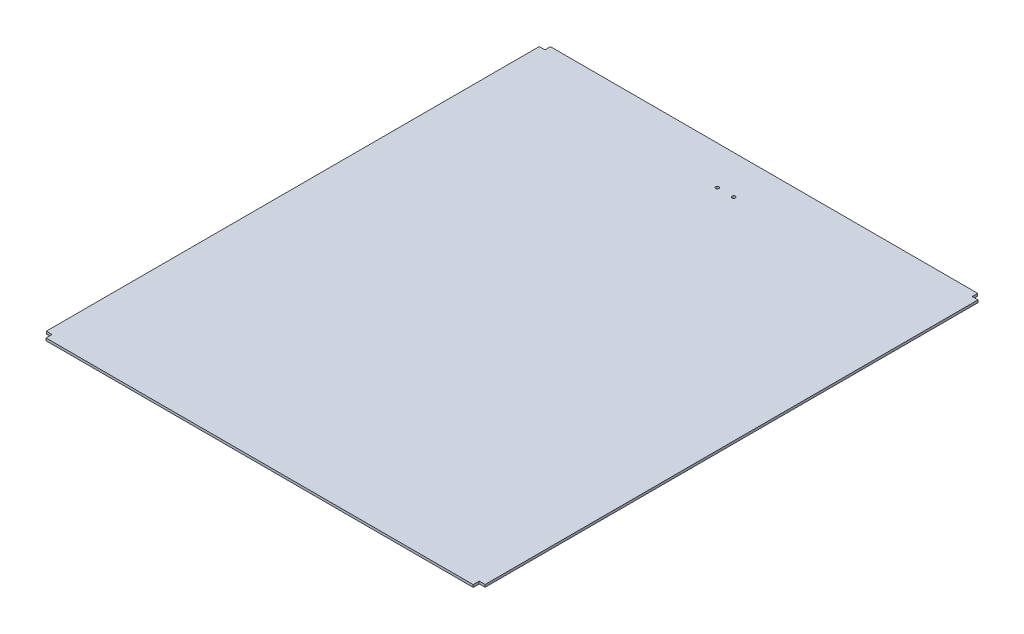
ISO-10303-21;
HEADER;
FILE_DESCRIPTION(('STEP AP214'),'2;1');
FILE_NAME('part.step','',(''),(''),'','','');
FILE_SCHEMA(('AUTOMOTIVE_DESIGN { 1 0 10303 214 1 1 1 1 }'));
ENDSEC;
DATA;
#1=APPLICATION_CONTEXT('core data for automotive mechanical design processes');
#2=APPLICATION_PROTOCOL_DEFINITION('international standard','automotive_design',2000,#1);
#3=PRODUCT_CONTEXT('',#1,'mechanical');
#4=PRODUCT('Part','Part','',(#3));
#5=PRODUCT_RELATED_PRODUCT_CATEGORY('part','',(#4));
#6=PRODUCT_DEFINITION_FORMATION('','',#4);
#7=PRODUCT_DEFINITION_CONTEXT('part definition',#1,'design');
#8=PRODUCT_DEFINITION('design','',#6,#7);
#9=PRODUCT_DEFINITION_SHAPE('','',#8);
#10=(LENGTH_UNIT() NAMED_UNIT(*) SI_UNIT(.MILLI.,.METRE.));
#11=(NAMED_UNIT(*) PLANE_ANGLE_UNIT() SI_UNIT($,.RADIAN.));
#12=(NAMED_UNIT(*) SI_UNIT($,.STERADIAN.) SOLID_ANGLE_UNIT());
#13=UNCERTAINTY_MEASURE_WITH_UNIT(LENGTH_MEASURE(1.E-05),#10,'distance_accuracy_value','');
#14=(GEOMETRIC_REPRESENTATION_CONTEXT(3) GLOBAL_UNCERTAINTY_ASSIGNED_CONTEXT((#13)) GLOBAL_UNIT_ASSIGNED_CONTEXT((#10,
#11,#12)) REPRESENTATION_CONTEXT('',''));
#15=CARTESIAN_POINT('',(0.,0.,0.));
#16=DIRECTION('',(0.,0.,1.));
#17=DIRECTION('',(1.,0.,0.));
#18=AXIS2_PLACEMENT_3D('',#15,#16,#17);
#19=CARTESIAN_POINT('',(0.0465208544824236,3.,-0.291126182503376));
#20=DIRECTION('',(0.,0.,-1.));
#21=DIRECTION('',(-1.,0.,0.));
#22=AXIS2_PLACEMENT_3D('',#19,#20,#21);
#23=PLANE('',#22);
#24=DIRECTION('',(0.,-1.,0.));
#25=VECTOR('',#24,1.);
#26=CARTESIAN_POINT('',(7.00000000000001,3.,-0.291126182503376));
#27=LINE('',#26,#25);
#28=CARTESIAN_POINT('',(6.99999999999996,3.,-0.291126182503376));
#29=VERTEX_POINT('',#28);
#30=CARTESIAN_POINT('',(6.99999999999996,0.,-0.291126182503376));
#31=VERTEX_POINT('',#30);
#32=EDGE_CURVE('E165',#29,#31,#27,.T.);
#33=ORIENTED_EDGE('',*,*,#32,.F.);
#34=DIRECTION('',(1.,0.,0.));
#35=VECTOR('',#34,1.);
#36=CARTESIAN_POINT('',(0.0465208544824236,3.,-0.291126182503376));
#37=LINE('',#36,#35);
#38=CARTESIAN_POINT('',(0.0465208544824236,3.,-0.291126182503376));
#39=VERTEX_POINT('',#38);
#40=EDGE_CURVE('E134',#39,#29,#37,.T.);
#41=ORIENTED_EDGE('',*,*,#40,.F.);
#42=DIRECTION('',(0.,-1.,0.));
#43=VECTOR('',#42,1.);
#44=CARTESIAN_POINT('',(0.0465208544824236,3.,-0.291126182503376));
#45=LINE('',#44,#43);
#46=CARTESIAN_POINT('',(0.0465208544824236,0.,-0.291126182503376));
#47=VERTEX_POINT('',#46);
#48=EDGE_CURVE('E11',#39,#47,#45,.T.);
#49=ORIENTED_EDGE('',*,*,#48,.T.);
#50=DIRECTION('',(1.,0.,0.));
#51=VECTOR('',#50,1.);
#52=CARTESIAN_POINT('',(0.0465208544824236,0.,-0.291126182503376));
#53=LINE('',#52,#51);
#54=EDGE_CURVE('E181',#47,#31,#53,.T.);
#55=ORIENTED_EDGE('',*,*,#54,.T.);
#56=EDGE_LOOP('',(#33,#41,#49,#55));
#57=FACE_BOUND('',#56,.T.);
#58=ADVANCED_FACE('F34',(#57),#23,.F.);
#59=DIRECTION('',(0.,1.,0.));
#60=VECTOR('',#59,1.);
#61=CARTESIAN_POINT('',(527.,3.,-0.291126182503376));
#62=LINE('',#61,#60);
#63=CARTESIAN_POINT('',(527.,0.,-0.291126182503376));
#64=VERTEX_POINT('',#63);
#65=CARTESIAN_POINT('',(527.,3.,-0.291126182503376));
#66=VERTEX_POINT('',#65);
#67=EDGE_CURVE('E155',#64,#66,#62,.T.);
#68=ORIENTED_EDGE('',*,*,#67,.F.);
#69=CARTESIAN_POINT('',(534.046520854482,0.,-0.291126182503376));
#70=VERTEX_POINT('',#69);
#71=EDGE_CURVE('E180',#64,#70,#53,.T.);
#72=ORIENTED_EDGE('',*,*,#71,.T.);
#73=DIRECTION('',(0.,-1.,0.));
#74=VECTOR('',#73,1.);
#75=CARTESIAN_POINT('',(534.046520854482,3.,-0.291126182503376));
#76=LINE('',#75,#74);
#77=CARTESIAN_POINT('',(534.046520854482,3.,-0.291126182503376));
#78=VERTEX_POINT('',#77);
#79=EDGE_CURVE('E43',#78,#70,#76,.T.);
#80=ORIENTED_EDGE('',*,*,#79,.F.);
#81=EDGE_CURVE('E170',#66,#78,#37,.T.);
#82=ORIENTED_EDGE('',*,*,#81,.F.);
#83=EDGE_LOOP('',(#68,#72,#80,#82));
#84=FACE_BOUND('',#83,.T.);
#85=ADVANCED_FACE('F256',(#84),#23,.F.);
#86=CARTESIAN_POINT('',(0.0465208544824236,3.,-600.291126182503));
#87=DIRECTION('',(0.,0.,1.));
#88=DIRECTION('',(1.,0.,0.));
#89=AXIS2_PLACEMENT_3D('',#86,#87,#88);
#90=PLANE('',#89);
#91=DIRECTION('',(0.,1.,0.));
#92=VECTOR('',#91,1.);
#93=CARTESIAN_POINT('',(6.99999999999992,3.,-600.291126182503));
#94=LINE('',#93,#92);
#95=CARTESIAN_POINT('',(6.99999999999992,0.,-600.291126182503));
#96=VERTEX_POINT('',#95);
#97=CARTESIAN_POINT('',(6.99999999999996,3.,-600.291126182503));
#98=VERTEX_POINT('',#97);
#99=EDGE_CURVE('E163',#96,#98,#94,.T.);
#100=ORIENTED_EDGE('',*,*,#99,.F.);
#101=DIRECTION('',(-1.,0.,0.));
#102=VECTOR('',#101,1.);
#103=CARTESIAN_POINT('',(0.0465208544824236,0.,-600.291126182503));
#104=LINE('',#103,#102);
#105=CARTESIAN_POINT('',(0.0465208544824236,0.,-600.291126182503));
#106=VERTEX_POINT('',#105);
#107=EDGE_CURVE('E185',#96,#106,#104,.T.);
#108=ORIENTED_EDGE('',*,*,#107,.T.);
#109=DIRECTION('',(0.,-1.,0.));
#110=VECTOR('',#109,1.);
#111=CARTESIAN_POINT('',(0.0465208544824236,3.,-600.291126182503));
#112=LINE('',#111,#110);
#113=CARTESIAN_POINT('',(0.0465208544824236,3.,-600.291126182503));
#114=VERTEX_POINT('',#113);
#115=EDGE_CURVE('E177',#114,#106,#112,.T.);
#116=ORIENTED_EDGE('',*,*,#115,.F.);
#117=DIRECTION('',(-1.,0.,0.));
#118=VECTOR('',#117,1.);
#119=CARTESIAN_POINT('',(0.0465208544824236,3.,-600.291126182503));
#120=LINE('',#119,#118);
#121=EDGE_CURVE('E51',#98,#114,#120,.T.);
#122=ORIENTED_EDGE('',*,*,#121,.F.);
#123=EDGE_LOOP('',(#100,#108,#116,#122));
#124=FACE_BOUND('',#123,.T.);
#125=ADVANCED_FACE('F261',(#124),#90,.F.);
#126=DIRECTION('',(0.,-1.,0.));
#127=VECTOR('',#126,1.);
#128=CARTESIAN_POINT('',(527.,3.,-600.291126182503));
#129=LINE('',#128,#127);
#130=CARTESIAN_POINT('',(527.,3.,-600.291126182503));
#131=VERTEX_POINT('',#130);
#132=CARTESIAN_POINT('',(527.,0.,-600.291126182503));
#133=VERTEX_POINT('',#132);
#134=EDGE_CURVE('E59',#131,#133,#129,.T.);
#135=ORIENTED_EDGE('',*,*,#134,.F.);
#136=CARTESIAN_POINT('',(534.046520854482,3.,-600.291126182503));
#137=VERTEX_POINT('',#136);
#138=EDGE_CURVE('E175',#137,#131,#120,.T.);
#139=ORIENTED_EDGE('',*,*,#138,.F.);
#140=DIRECTION('',(0.,-1.,0.));
#141=VECTOR('',#140,1.);
#142=CARTESIAN_POINT('',(534.046520854482,3.,-600.291126182503));
#143=LINE('',#142,#141);
#144=CARTESIAN_POINT('',(534.046520854482,0.,-600.291126182503));
#145=VERTEX_POINT('',#144);
#146=EDGE_CURVE('E189',#137,#145,#143,.T.);
#147=ORIENTED_EDGE('',*,*,#146,.T.);
#148=EDGE_CURVE('E171',#145,#133,#104,.T.);
#149=ORIENTED_EDGE('',*,*,#148,.T.);
#150=EDGE_LOOP('',(#135,#139,#147,#149));
#151=FACE_BOUND('',#150,.T.);
#152=ADVANCED_FACE('F270',(#151),#90,.F.);
#153=CARTESIAN_POINT('',(0.0465208544824236,3.,-0.291126182503376));
#154=DIRECTION('',(1.,0.,0.));
#155=DIRECTION('',(0.,0.,-1.));
#156=AXIS2_PLACEMENT_3D('',#153,#154,#155);
#157=PLANE('',#156);
#158=DIRECTION('',(0.,0.,1.));
#159=VECTOR('',#158,1.);
#160=CARTESIAN_POINT('',(0.0465208544824236,0.,-0.291126182503376));
#161=LINE('',#160,#159);
#162=EDGE_CURVE('E167',#106,#47,#161,.T.);
#163=ORIENTED_EDGE('',*,*,#162,.T.);
#164=ORIENTED_EDGE('',*,*,#48,.F.);
#165=DIRECTION('',(0.,0.,1.));
#166=VECTOR('',#165,1.);
#167=CARTESIAN_POINT('',(0.0465208544824236,3.,-0.291126182503376));
#168=LINE('',#167,#166);
#169=EDGE_CURVE('E168',#114,#39,#168,.T.);
#170=ORIENTED_EDGE('',*,*,#169,.F.);
#171=ORIENTED_EDGE('',*,*,#115,.T.);
#172=EDGE_LOOP('',(#163,#164,#170,#171));
#173=FACE_BOUND('',#172,.T.);
#174=ADVANCED_FACE('F36',(#173),#157,.F.);
#175=CARTESIAN_POINT('',(534.046520854482,3.,-0.291126182503376));
#176=DIRECTION('',(-1.,0.,0.));
#177=DIRECTION('',(0.,0.,1.));
#178=AXIS2_PLACEMENT_3D('',#175,#176,#177);
#179=PLANE('',#178);
#180=DIRECTION('',(0.,0.,-1.));
#181=VECTOR('',#180,1.);
#182=CARTESIAN_POINT('',(534.046520854482,0.,-0.291126182503376));
#183=LINE('',#182,#181);
#184=EDGE_CURVE('E183',#70,#145,#183,.T.);
#185=ORIENTED_EDGE('',*,*,#184,.T.);
#186=ORIENTED_EDGE('',*,*,#146,.F.);
#187=DIRECTION('',(0.,0.,-1.));
#188=VECTOR('',#187,1.);
#189=CARTESIAN_POINT('',(534.046520854482,3.,-0.291126182503376));
#190=LINE('',#189,#188);
#191=EDGE_CURVE('E173',#78,#137,#190,.T.);
#192=ORIENTED_EDGE('',*,*,#191,.F.);
#193=ORIENTED_EDGE('',*,*,#79,.T.);
#194=EDGE_LOOP('',(#185,#186,#192,#193));
#195=FACE_BOUND('',#194,.T.);
#196=ADVANCED_FACE('F264',(#195),#179,.F.);
#197=CARTESIAN_POINT('',(0.,3.,0.));
#198=DIRECTION('',(0.,-1.,0.));
#199=DIRECTION('',(0.,0.,-1.));
#200=AXIS2_PLACEMENT_3D('',#197,#198,#199);
#201=PLANE('',#200);
#202=CARTESIAN_POINT('',(257.025,3.,-560.));
#203=DIRECTION('',(0.,1.,0.));
#204=DIRECTION('',(0.,0.,1.));
#205=AXIS2_PLACEMENT_3D('',#202,#203,#204);
#206=CIRCLE('',#205,2.);
#207=CARTESIAN_POINT('',(257.025,3.,-558.));
#208=VERTEX_POINT('',#207);
#209=EDGE_CURVE('E195',#208,#208,#206,.T.);
#210=ORIENTED_EDGE('',*,*,#209,.F.);
#211=EDGE_LOOP('',(#210));
#212=FACE_BOUND('',#211,.T.);
#213=CARTESIAN_POINT('',(277.025,3.,-560.));
#214=DIRECTION('',(0.,1.,0.));
#215=DIRECTION('',(0.,0.,1.));
#216=AXIS2_PLACEMENT_3D('',#213,#214,#215);
#217=CIRCLE('',#216,2.);
#218=CARTESIAN_POINT('',(277.025,3.,-558.));
#219=VERTEX_POINT('',#218);
#220=EDGE_CURVE('E200',#219,#219,#217,.T.);
#221=ORIENTED_EDGE('',*,*,#220,.F.);
#222=EDGE_LOOP('',(#221));
#223=FACE_BOUND('',#222,.T.);
#224=ORIENTED_EDGE('',*,*,#138,.T.);
#225=DIRECTION('',(0.,0.,-1.));
#226=VECTOR('',#225,1.);
#227=CARTESIAN_POINT('',(527.,3.,-607.));
#228=LINE('',#227,#226);
#229=CARTESIAN_POINT('',(527.,3.,-607.));
#230=VERTEX_POINT('',#229);
#231=EDGE_CURVE('E148',#131,#230,#228,.T.);
#232=ORIENTED_EDGE('',*,*,#231,.T.);
#233=DIRECTION('',(-1.,0.,0.));
#234=VECTOR('',#233,1.);
#235=CARTESIAN_POINT('',(6.99999999999992,3.,-607.));
#236=LINE('',#235,#234);
#237=CARTESIAN_POINT('',(6.99999999999992,3.,-607.));
#238=VERTEX_POINT('',#237);
#239=EDGE_CURVE('E210',#230,#238,#236,.T.);
#240=ORIENTED_EDGE('',*,*,#239,.T.);
#241=DIRECTION('',(0.,0.,1.));
#242=VECTOR('',#241,1.);
#243=CARTESIAN_POINT('',(6.99999999999992,3.,-607.));
#244=LINE('',#243,#242);
#245=EDGE_CURVE('E138',#238,#98,#244,.T.);
#246=ORIENTED_EDGE('',*,*,#245,.T.);
#247=ORIENTED_EDGE('',*,*,#121,.T.);
#248=ORIENTED_EDGE('',*,*,#169,.T.);
#249=ORIENTED_EDGE('',*,*,#40,.T.);
#250=CARTESIAN_POINT('',(7.00000000000001,3.,7.));
#251=VERTEX_POINT('',#250);
#252=EDGE_CURVE('E127',#29,#251,#244,.T.);
#253=ORIENTED_EDGE('',*,*,#252,.T.);
#254=DIRECTION('',(1.,0.,0.));
#255=VECTOR('',#254,1.);
#256=CARTESIAN_POINT('',(7.00000000000001,3.,7.));
#257=LINE('',#256,#255);
#258=CARTESIAN_POINT('',(527.,3.,7.));
#259=VERTEX_POINT('',#258);
#260=EDGE_CURVE('E131',#251,#259,#257,.T.);
#261=ORIENTED_EDGE('',*,*,#260,.T.);
#262=EDGE_CURVE('E208',#259,#66,#228,.T.);
#263=ORIENTED_EDGE('',*,*,#262,.T.);
#264=ORIENTED_EDGE('',*,*,#81,.T.);
#265=ORIENTED_EDGE('',*,*,#191,.T.);
#266=EDGE_LOOP('',(#224,#232,#240,#246,#247,#248,#249,#253,#261,#263,#264,#265));
#267=FACE_BOUND('',#266,.T.);
#268=ADVANCED_FACE('F129',(#212,#223,#267),#201,.F.);
#269=CARTESIAN_POINT('',(0.,0.,0.));
#270=DIRECTION('',(0.,-1.,0.));
#271=DIRECTION('',(0.,0.,-1.));
#272=AXIS2_PLACEMENT_3D('',#269,#270,#271);
#273=PLANE('',#272);
#274=CARTESIAN_POINT('',(257.025,0.,-560.));
#275=DIRECTION('',(0.,-1.,0.));
#276=DIRECTION('',(0.,0.,-1.));
#277=AXIS2_PLACEMENT_3D('',#274,#275,#276);
#278=CIRCLE('',#277,2.);
#279=CARTESIAN_POINT('',(257.025,0.,-562.));
#280=VERTEX_POINT('',#279);
#281=EDGE_CURVE('E38',#280,#280,#278,.T.);
#282=ORIENTED_EDGE('',*,*,#281,.F.);
#283=EDGE_LOOP('',(#282));
#284=FACE_BOUND('',#283,.T.);
#285=CARTESIAN_POINT('',(277.025,0.,-560.));
#286=DIRECTION('',(0.,-1.,0.));
#287=DIRECTION('',(0.,0.,-1.));
#288=AXIS2_PLACEMENT_3D('',#285,#286,#287);
#289=CIRCLE('',#288,2.);
#290=CARTESIAN_POINT('',(277.025,0.,-562.));
#291=VERTEX_POINT('',#290);
#292=EDGE_CURVE('E193',#291,#291,#289,.T.);
#293=ORIENTED_EDGE('',*,*,#292,.F.);
#294=EDGE_LOOP('',(#293));
#295=FACE_BOUND('',#294,.T.);
#296=ORIENTED_EDGE('',*,*,#71,.F.);
#297=DIRECTION('',(0.,0.,-1.));
#298=VECTOR('',#297,1.);
#299=CARTESIAN_POINT('',(527.,0.,-607.));
#300=LINE('',#299,#298);
#301=CARTESIAN_POINT('',(527.,0.,7.));
#302=VERTEX_POINT('',#301);
#303=EDGE_CURVE('E219',#302,#64,#300,.T.);
#304=ORIENTED_EDGE('',*,*,#303,.F.);
#305=DIRECTION('',(1.,0.,0.));
#306=VECTOR('',#305,1.);
#307=CARTESIAN_POINT('',(7.00000000000001,0.,7.));
#308=LINE('',#307,#306);
#309=CARTESIAN_POINT('',(7.00000000000001,0.,7.));
#310=VERTEX_POINT('',#309);
#311=EDGE_CURVE('E216',#310,#302,#308,.T.);
#312=ORIENTED_EDGE('',*,*,#311,.F.);
#313=DIRECTION('',(0.,0.,1.));
#314=VECTOR('',#313,1.);
#315=CARTESIAN_POINT('',(6.99999999999992,0.,-607.));
#316=LINE('',#315,#314);
#317=EDGE_CURVE('E152',#31,#310,#316,.T.);
#318=ORIENTED_EDGE('',*,*,#317,.F.);
#319=ORIENTED_EDGE('',*,*,#54,.F.);
#320=ORIENTED_EDGE('',*,*,#162,.F.);
#321=ORIENTED_EDGE('',*,*,#107,.F.);
#322=CARTESIAN_POINT('',(6.99999999999992,0.,-607.));
#323=VERTEX_POINT('',#322);
#324=EDGE_CURVE('E213',#323,#96,#316,.T.);
#325=ORIENTED_EDGE('',*,*,#324,.F.);
#326=DIRECTION('',(-1.,0.,0.));
#327=VECTOR('',#326,1.);
#328=CARTESIAN_POINT('',(6.99999999999992,0.,-607.));
#329=LINE('',#328,#327);
#330=CARTESIAN_POINT('',(527.,0.,-607.));
#331=VERTEX_POINT('',#330);
#332=EDGE_CURVE('E139',#331,#323,#329,.T.);
#333=ORIENTED_EDGE('',*,*,#332,.F.);
#334=EDGE_CURVE('E218',#133,#331,#300,.T.);
#335=ORIENTED_EDGE('',*,*,#334,.F.);
#336=ORIENTED_EDGE('',*,*,#148,.F.);
#337=ORIENTED_EDGE('',*,*,#184,.F.);
#338=EDGE_LOOP('',(#296,#304,#312,#318,#319,#320,#321,#325,#333,#335,#336,#337));
#339=FACE_BOUND('',#338,.T.);
#340=ADVANCED_FACE('F236',(#284,#295,#339),#273,.T.);
#341=CARTESIAN_POINT('',(6.99999999999992,3.,-607.));
#342=DIRECTION('',(0.,0.,1.));
#343=DIRECTION('',(1.,0.,0.));
#344=AXIS2_PLACEMENT_3D('',#341,#342,#343);
#345=PLANE('',#344);
#346=ORIENTED_EDGE('',*,*,#332,.T.);
#347=DIRECTION('',(0.,-1.,0.));
#348=VECTOR('',#347,1.);
#349=CARTESIAN_POINT('',(6.99999999999992,3.,-607.));
#350=LINE('',#349,#348);
#351=EDGE_CURVE('E212',#238,#323,#350,.T.);
#352=ORIENTED_EDGE('',*,*,#351,.F.);
#353=ORIENTED_EDGE('',*,*,#239,.F.);
#354=DIRECTION('',(0.,-1.,0.));
#355=VECTOR('',#354,1.);
#356=CARTESIAN_POINT('',(527.,3.,-607.));
#357=LINE('',#356,#355);
#358=EDGE_CURVE('E157',#230,#331,#357,.T.);
#359=ORIENTED_EDGE('',*,*,#358,.T.);
#360=EDGE_LOOP('',(#346,#352,#353,#359));
#361=FACE_BOUND('',#360,.T.);
#362=ADVANCED_FACE('F229',(#361),#345,.F.);
#363=CARTESIAN_POINT('',(527.,3.,-607.));
#364=DIRECTION('',(-1.,0.,0.));
#365=DIRECTION('',(0.,0.,1.));
#366=AXIS2_PLACEMENT_3D('',#363,#364,#365);
#367=PLANE('',#366);
#368=ORIENTED_EDGE('',*,*,#231,.F.);
#369=ORIENTED_EDGE('',*,*,#134,.T.);
#370=ORIENTED_EDGE('',*,*,#334,.T.);
#371=ORIENTED_EDGE('',*,*,#358,.F.);
#372=EDGE_LOOP('',(#368,#369,#370,#371));
#373=FACE_BOUND('',#372,.T.);
#374=ADVANCED_FACE('F242',(#373),#367,.F.);
#375=CARTESIAN_POINT('',(6.99999999999992,3.,-607.));
#376=DIRECTION('',(1.,0.,0.));
#377=DIRECTION('',(0.,0.,-1.));
#378=AXIS2_PLACEMENT_3D('',#375,#376,#377);
#379=PLANE('',#378);
#380=ORIENTED_EDGE('',*,*,#324,.T.);
#381=ORIENTED_EDGE('',*,*,#99,.T.);
#382=ORIENTED_EDGE('',*,*,#245,.F.);
#383=ORIENTED_EDGE('',*,*,#351,.T.);
#384=EDGE_LOOP('',(#380,#381,#382,#383));
#385=FACE_BOUND('',#384,.T.);
#386=ADVANCED_FACE('F240',(#385),#379,.F.);
#387=ORIENTED_EDGE('',*,*,#252,.F.);
#388=ORIENTED_EDGE('',*,*,#32,.T.);
#389=ORIENTED_EDGE('',*,*,#317,.T.);
#390=DIRECTION('',(0.,-1.,0.));
#391=VECTOR('',#390,1.);
#392=CARTESIAN_POINT('',(7.00000000000001,3.,7.));
#393=LINE('',#392,#391);
#394=EDGE_CURVE('E144',#251,#310,#393,.T.);
#395=ORIENTED_EDGE('',*,*,#394,.F.);
#396=EDGE_LOOP('',(#387,#388,#389,#395));
#397=FACE_BOUND('',#396,.T.);
#398=ADVANCED_FACE('F150',(#397),#379,.F.);
#399=ORIENTED_EDGE('',*,*,#303,.T.);
#400=ORIENTED_EDGE('',*,*,#67,.T.);
#401=ORIENTED_EDGE('',*,*,#262,.F.);
#402=DIRECTION('',(0.,-1.,0.));
#403=VECTOR('',#402,1.);
#404=CARTESIAN_POINT('',(527.,3.,7.));
#405=LINE('',#404,#403);
#406=EDGE_CURVE('E146',#259,#302,#405,.T.);
#407=ORIENTED_EDGE('',*,*,#406,.T.);
#408=EDGE_LOOP('',(#399,#400,#401,#407));
#409=FACE_BOUND('',#408,.T.);
#410=ADVANCED_FACE('F245',(#409),#367,.F.);
#411=CARTESIAN_POINT('',(7.00000000000001,3.,7.));
#412=DIRECTION('',(0.,0.,-1.));
#413=DIRECTION('',(-1.,0.,0.));
#414=AXIS2_PLACEMENT_3D('',#411,#412,#413);
#415=PLANE('',#414);
#416=ORIENTED_EDGE('',*,*,#311,.T.);
#417=ORIENTED_EDGE('',*,*,#406,.F.);
#418=ORIENTED_EDGE('',*,*,#260,.F.);
#419=ORIENTED_EDGE('',*,*,#394,.T.);
#420=EDGE_LOOP('',(#416,#417,#418,#419));
#421=FACE_BOUND('',#420,.T.);
#422=ADVANCED_FACE('F143',(#421),#415,.F.);
#423=CARTESIAN_POINT('',(277.025,-7.,-560.));
#424=DIRECTION('',(0.,1.,0.));
#425=DIRECTION('',(0.,0.,1.));
#426=AXIS2_PLACEMENT_3D('',#423,#424,#425);
#427=CYLINDRICAL_SURFACE('',#426,2.);
#428=ORIENTED_EDGE('',*,*,#292,.T.);
#429=EDGE_LOOP('',(#428));
#430=FACE_BOUND('',#429,.T.);
#431=ORIENTED_EDGE('',*,*,#220,.T.);
#432=EDGE_LOOP('',(#431));
#433=FACE_BOUND('',#432,.T.);
#434=ADVANCED_FACE('F278',(#430,#433),#427,.F.);
#435=CARTESIAN_POINT('',(257.025,-7.,-560.));
#436=DIRECTION('',(0.,1.,0.));
#437=DIRECTION('',(0.,0.,1.));
#438=AXIS2_PLACEMENT_3D('',#435,#436,#437);
#439=CYLINDRICAL_SURFACE('',#438,2.);
#440=ORIENTED_EDGE('',*,*,#281,.T.);
#441=EDGE_LOOP('',(#440));
#442=FACE_BOUND('',#441,.T.);
#443=ORIENTED_EDGE('',*,*,#209,.T.);
#444=EDGE_LOOP('',(#443));
#445=FACE_BOUND('',#444,.T.);
#446=ADVANCED_FACE('F282',(#442,#445),#439,.F.);
#447=CLOSED_SHELL('',(#58,#85,#125,#152,#174,#196,#268,#340,#362,#374,#386,#398,#410,#422,#434,#446));
#448=MANIFOLD_SOLID_BREP('B2',#447);
#449=ADVANCED_BREP_SHAPE_REPRESENTATION('',(#18,#448),#14);
#450=SHAPE_DEFINITION_REPRESENTATION(#9,#449);
ENDSEC;
END-ISO-10303-21;
